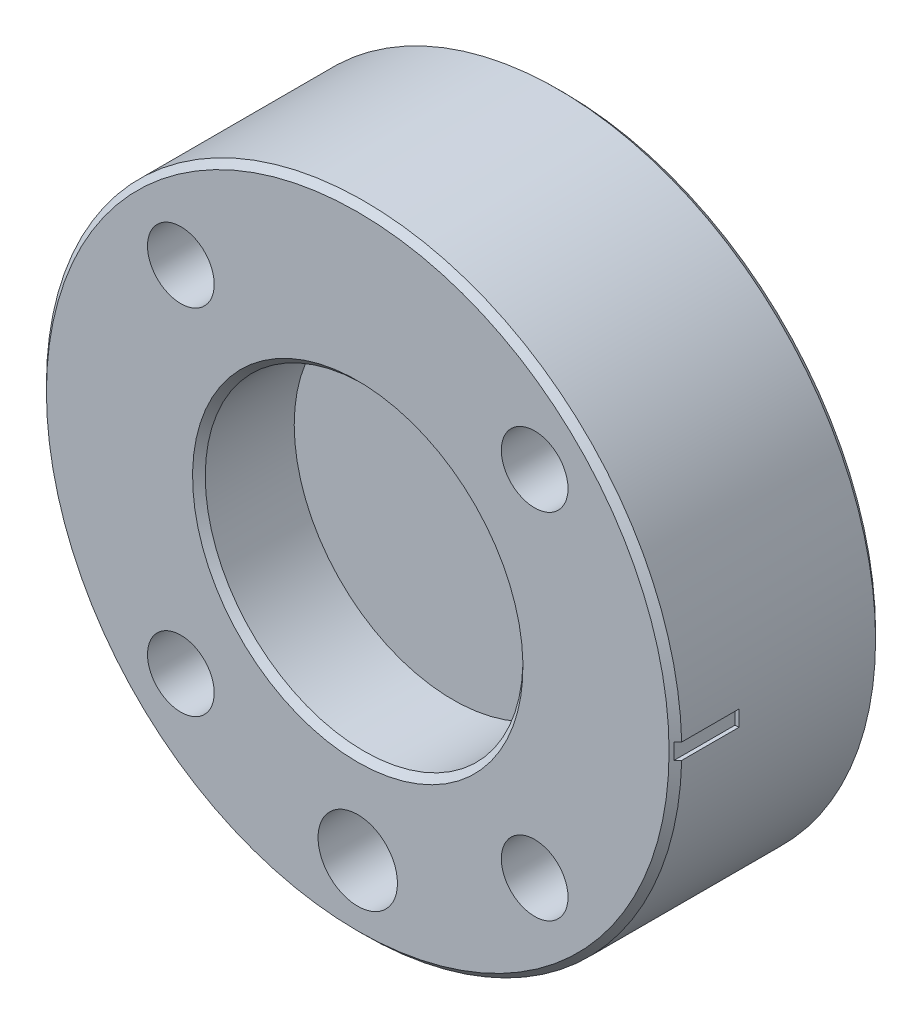
ISO-10303-21;
HEADER;
FILE_DESCRIPTION(('STEP AP214'),'2;1');
FILE_NAME('part.step','',(''),(''),'','','');
FILE_SCHEMA(('AUTOMOTIVE_DESIGN { 1 0 10303 214 1 1 1 1 }'));
ENDSEC;
DATA;
#1=APPLICATION_CONTEXT('core data for automotive mechanical design processes');
#2=APPLICATION_PROTOCOL_DEFINITION('international standard','automotive_design',2000,#1);
#3=PRODUCT_CONTEXT('',#1,'mechanical');
#4=PRODUCT('Part','Part','',(#3));
#5=PRODUCT_RELATED_PRODUCT_CATEGORY('part','',(#4));
#6=PRODUCT_DEFINITION_FORMATION('','',#4);
#7=PRODUCT_DEFINITION_CONTEXT('part definition',#1,'design');
#8=PRODUCT_DEFINITION('design','',#6,#7);
#9=PRODUCT_DEFINITION_SHAPE('','',#8);
#10=(LENGTH_UNIT() NAMED_UNIT(*) SI_UNIT(.MILLI.,.METRE.));
#11=(NAMED_UNIT(*) PLANE_ANGLE_UNIT() SI_UNIT($,.RADIAN.));
#12=(NAMED_UNIT(*) SI_UNIT($,.STERADIAN.) SOLID_ANGLE_UNIT());
#13=UNCERTAINTY_MEASURE_WITH_UNIT(LENGTH_MEASURE(1.E-05),#10,'distance_accuracy_value','');
#14=(GEOMETRIC_REPRESENTATION_CONTEXT(3) GLOBAL_UNCERTAINTY_ASSIGNED_CONTEXT((#13)) GLOBAL_UNIT_ASSIGNED_CONTEXT((#10,
#11,#12)) REPRESENTATION_CONTEXT('',''));
#15=CARTESIAN_POINT('',(0.,0.,0.));
#16=DIRECTION('',(0.,0.,1.));
#17=DIRECTION('',(1.,0.,0.));
#18=AXIS2_PLACEMENT_3D('',#15,#16,#17);
#19=CARTESIAN_POINT('',(0.,0.,7.));
#20=DIRECTION('',(0.,0.,-1.));
#21=DIRECTION('',(-1.,0.,0.));
#22=AXIS2_PLACEMENT_3D('',#19,#20,#21);
#23=PLANE('',#22);
#24=CARTESIAN_POINT('',(0.,0.,7.));
#25=DIRECTION('',(0.,0.,-1.));
#26=DIRECTION('',(-1.,0.,0.));
#27=AXIS2_PLACEMENT_3D('',#24,#25,#26);
#28=CIRCLE('',#27,10.);
#29=CARTESIAN_POINT('',(-10.,0.,7.));
#30=VERTEX_POINT('',#29);
#31=EDGE_CURVE('E89',#30,#30,#28,.F.);
#32=ORIENTED_EDGE('',*,*,#31,.T.);
#33=EDGE_LOOP('',(#32));
#34=FACE_BOUND('',#33,.T.);
#35=ADVANCED_FACE('F16',(#34),#23,.F.);
#36=CARTESIAN_POINT('',(11.1369318036882,11.136931803688,2.59999999991578));
#37=DIRECTION('',(0.,0.,1.));
#38=DIRECTION('',(1.,0.,0.));
#39=AXIS2_PLACEMENT_3D('',#36,#37,#38);
#40=CONICAL_SURFACE('',#39,2.09999999990165,1.02974425856416);
#41=CARTESIAN_POINT('',(11.1369318038328,11.136931803688,1.33819269993296));
#42=VERTEX_POINT('',#41);
#43=VERTEX_LOOP('',#42);
#44=FACE_BOUND('',#43,.T.);
#45=CARTESIAN_POINT('',(11.1369318036882,11.136931803688,2.6));
#46=DIRECTION('',(0.,0.,1.));
#47=DIRECTION('',(1.,0.,0.));
#48=AXIS2_PLACEMENT_3D('',#45,#46,#47);
#49=CIRCLE('',#48,2.09999999999999);
#50=CARTESIAN_POINT('',(13.2369318036882,11.136931803688,2.6));
#51=VERTEX_POINT('',#50);
#52=EDGE_CURVE('E86',#51,#51,#49,.T.);
#53=ORIENTED_EDGE('',*,*,#52,.T.);
#54=EDGE_LOOP('',(#53));
#55=FACE_BOUND('',#54,.T.);
#56=ADVANCED_FACE('F80',(#44,#55),#40,.F.);
#57=CARTESIAN_POINT('',(-11.1369318036881,11.1369318036882,2.59999999991578));
#58=DIRECTION('',(0.,0.,1.));
#59=DIRECTION('',(1.,0.,0.));
#60=AXIS2_PLACEMENT_3D('',#57,#58,#59);
#61=CONICAL_SURFACE('',#60,2.09999999978287,1.02974425851824);
#62=CARTESIAN_POINT('',(-11.1369318037449,11.1369318036882,1.33819269981927));
#63=VERTEX_POINT('',#62);
#64=VERTEX_LOOP('',#63);
#65=FACE_BOUND('',#64,.T.);
#66=CARTESIAN_POINT('',(-11.1369318036881,11.1369318036882,2.6));
#67=DIRECTION('',(0.,0.,1.));
#68=DIRECTION('',(1.,0.,0.));
#69=AXIS2_PLACEMENT_3D('',#66,#67,#68);
#70=CIRCLE('',#69,2.09999999999999);
#71=CARTESIAN_POINT('',(-9.03693180368807,11.1369318036882,2.6));
#72=VERTEX_POINT('',#71);
#73=EDGE_CURVE('E88',#72,#72,#70,.T.);
#74=ORIENTED_EDGE('',*,*,#73,.T.);
#75=EDGE_LOOP('',(#74));
#76=FACE_BOUND('',#75,.T.);
#77=ADVANCED_FACE('F83',(#65,#76),#61,.F.);
#78=CARTESIAN_POINT('',(-11.1369318036881,-11.1369318036881,2.60000000002947));
#79=DIRECTION('',(0.,0.,1.));
#80=DIRECTION('',(1.,0.,0.));
#81=AXIS2_PLACEMENT_3D('',#78,#79,#80);
#82=CONICAL_SURFACE('',#81,2.10000000006716,1.0297442586457);
#83=CARTESIAN_POINT('',(-11.1369318038328,-11.1369318036881,1.3381926999898));
#84=VERTEX_POINT('',#83);
#85=VERTEX_LOOP('',#84);
#86=FACE_BOUND('',#85,.T.);
#87=CARTESIAN_POINT('',(-11.1369318036881,-11.1369318036881,2.6));
#88=DIRECTION('',(0.,0.,1.));
#89=DIRECTION('',(1.,0.,0.));
#90=AXIS2_PLACEMENT_3D('',#87,#88,#89);
#91=CIRCLE('',#90,2.09999999999999);
#92=CARTESIAN_POINT('',(-9.03693180368814,-11.1369318036881,2.6));
#93=VERTEX_POINT('',#92);
#94=EDGE_CURVE('E92',#93,#93,#91,.T.);
#95=ORIENTED_EDGE('',*,*,#94,.T.);
#96=EDGE_LOOP('',(#95));
#97=FACE_BOUND('',#96,.T.);
#98=ADVANCED_FACE('F158',(#86,#97),#82,.F.);
#99=CARTESIAN_POINT('',(11.1369318036881,-11.1369318036881,2.59999999997262));
#100=DIRECTION('',(0.,0.,1.));
#101=DIRECTION('',(1.,0.,0.));
#102=AXIS2_PLACEMENT_3D('',#99,#100,#101);
#103=CONICAL_SURFACE('',#102,2.1000000001291,1.02974425864784);
#104=CARTESIAN_POINT('',(11.136931803776,-11.1369318036881,1.33819269996138));
#105=VERTEX_POINT('',#104);
#106=VERTEX_LOOP('',#105);
#107=FACE_BOUND('',#106,.T.);
#108=CARTESIAN_POINT('',(11.1369318036881,-11.1369318036881,2.6));
#109=DIRECTION('',(0.,0.,1.));
#110=DIRECTION('',(1.,0.,0.));
#111=AXIS2_PLACEMENT_3D('',#108,#109,#110);
#112=CIRCLE('',#111,2.09999999999999);
#113=CARTESIAN_POINT('',(13.2369318036881,-11.1369318036881,2.6));
#114=VERTEX_POINT('',#113);
#115=EDGE_CURVE('E153',#114,#114,#112,.T.);
#116=ORIENTED_EDGE('',*,*,#115,.T.);
#117=EDGE_LOOP('',(#116));
#118=FACE_BOUND('',#117,.T.);
#119=ADVANCED_FACE('F345',(#107,#118),#103,.F.);
#120=CARTESIAN_POINT('',(0.,-15.75,5.99999999991496));
#121=DIRECTION('',(0.,0.,1.));
#122=DIRECTION('',(0.,-1.,0.));
#123=AXIS2_PLACEMENT_3D('',#120,#121,#122);
#124=CONICAL_SURFACE('',#123,2.49999999988404,1.02974425862171);
#125=CARTESIAN_POINT('',(1.4210854715202E-10,-15.75,4.49784845235968));
#126=VERTEX_POINT('',#125);
#127=VERTEX_LOOP('',#126);
#128=FACE_BOUND('',#127,.T.);
#129=CARTESIAN_POINT('',(0.,-15.75,6.));
#130=DIRECTION('',(0.,0.,1.));
#131=DIRECTION('',(1.,0.,0.));
#132=AXIS2_PLACEMENT_3D('',#129,#130,#131);
#133=CIRCLE('',#132,2.49999999999999);
#134=CARTESIAN_POINT('',(2.49999999999999,-15.75,6.));
#135=VERTEX_POINT('',#134);
#136=EDGE_CURVE('E150',#135,#135,#133,.T.);
#137=ORIENTED_EDGE('',*,*,#136,.T.);
#138=EDGE_LOOP('',(#137));
#139=FACE_BOUND('',#138,.T.);
#140=ADVANCED_FACE('F243',(#128,#139),#124,.F.);
#141=CARTESIAN_POINT('',(0.,0.,13.));
#142=DIRECTION('',(0.,0.,-1.));
#143=DIRECTION('',(-1.,0.,0.));
#144=AXIS2_PLACEMENT_3D('',#141,#142,#143);
#145=CYLINDRICAL_SURFACE('',#144,10.);
#146=CARTESIAN_POINT('',(0.,0.,12.6));
#147=DIRECTION('',(0.,0.,1.));
#148=DIRECTION('',(0.,-1.,0.));
#149=AXIS2_PLACEMENT_3D('',#146,#147,#148);
#150=CIRCLE('',#149,10.);
#151=CARTESIAN_POINT('',(0.,-10.,12.6));
#152=VERTEX_POINT('',#151);
#153=EDGE_CURVE('E146',#152,#152,#150,.T.);
#154=ORIENTED_EDGE('',*,*,#153,.T.);
#155=EDGE_LOOP('',(#154));
#156=FACE_BOUND('',#155,.T.);
#157=ORIENTED_EDGE('',*,*,#31,.F.);
#158=EDGE_LOOP('',(#157));
#159=FACE_BOUND('',#158,.T.);
#160=ADVANCED_FACE('F234',(#156,#159),#145,.F.);
#161=CARTESIAN_POINT('',(11.1369318036882,11.136931803688,13.));
#162=DIRECTION('',(0.,0.,1.));
#163=DIRECTION('',(1.,0.,0.));
#164=AXIS2_PLACEMENT_3D('',#161,#162,#163);
#165=CYLINDRICAL_SURFACE('',#164,2.09999999999999);
#166=ORIENTED_EDGE('',*,*,#52,.F.);
#167=EDGE_LOOP('',(#166));
#168=FACE_BOUND('',#167,.T.);
#169=CARTESIAN_POINT('',(11.1369318036882,11.136931803688,13.));
#170=DIRECTION('',(0.,0.,1.));
#171=DIRECTION('',(1.,0.,0.));
#172=AXIS2_PLACEMENT_3D('',#169,#170,#171);
#173=CIRCLE('',#172,2.09999999999999);
#174=CARTESIAN_POINT('',(13.2369318036882,11.136931803688,13.));
#175=VERTEX_POINT('',#174);
#176=EDGE_CURVE('E149',#175,#175,#173,.F.);
#177=ORIENTED_EDGE('',*,*,#176,.F.);
#178=EDGE_LOOP('',(#177));
#179=FACE_BOUND('',#178,.T.);
#180=ADVANCED_FACE('F232',(#168,#179),#165,.F.);
#181=CARTESIAN_POINT('',(-11.1369318036881,11.1369318036882,13.));
#182=DIRECTION('',(0.,0.,1.));
#183=DIRECTION('',(1.,0.,0.));
#184=AXIS2_PLACEMENT_3D('',#181,#182,#183);
#185=CYLINDRICAL_SURFACE('',#184,2.09999999999999);
#186=ORIENTED_EDGE('',*,*,#73,.F.);
#187=EDGE_LOOP('',(#186));
#188=FACE_BOUND('',#187,.T.);
#189=CARTESIAN_POINT('',(-11.1369318036881,11.1369318036882,13.));
#190=DIRECTION('',(0.,0.,1.));
#191=DIRECTION('',(1.,0.,0.));
#192=AXIS2_PLACEMENT_3D('',#189,#190,#191);
#193=CIRCLE('',#192,2.09999999999999);
#194=CARTESIAN_POINT('',(-9.03693180368807,11.1369318036882,13.));
#195=VERTEX_POINT('',#194);
#196=EDGE_CURVE('E171',#195,#195,#193,.F.);
#197=ORIENTED_EDGE('',*,*,#196,.F.);
#198=EDGE_LOOP('',(#197));
#199=FACE_BOUND('',#198,.T.);
#200=ADVANCED_FACE('F164',(#188,#199),#185,.F.);
#201=CARTESIAN_POINT('',(-11.1369318036881,-11.1369318036881,13.));
#202=DIRECTION('',(0.,0.,1.));
#203=DIRECTION('',(1.,0.,0.));
#204=AXIS2_PLACEMENT_3D('',#201,#202,#203);
#205=CYLINDRICAL_SURFACE('',#204,2.09999999999999);
#206=ORIENTED_EDGE('',*,*,#94,.F.);
#207=EDGE_LOOP('',(#206));
#208=FACE_BOUND('',#207,.T.);
#209=CARTESIAN_POINT('',(-11.1369318036881,-11.1369318036881,13.));
#210=DIRECTION('',(0.,0.,1.));
#211=DIRECTION('',(1.,0.,0.));
#212=AXIS2_PLACEMENT_3D('',#209,#210,#211);
#213=CIRCLE('',#212,2.09999999999999);
#214=CARTESIAN_POINT('',(-9.03693180368814,-11.1369318036881,13.));
#215=VERTEX_POINT('',#214);
#216=EDGE_CURVE('E168',#215,#215,#213,.F.);
#217=ORIENTED_EDGE('',*,*,#216,.F.);
#218=EDGE_LOOP('',(#217));
#219=FACE_BOUND('',#218,.T.);
#220=ADVANCED_FACE('F160',(#208,#219),#205,.F.);
#221=CARTESIAN_POINT('',(11.1369318036881,-11.1369318036881,13.));
#222=DIRECTION('',(0.,0.,1.));
#223=DIRECTION('',(1.,0.,0.));
#224=AXIS2_PLACEMENT_3D('',#221,#222,#223);
#225=CYLINDRICAL_SURFACE('',#224,2.09999999999999);
#226=ORIENTED_EDGE('',*,*,#115,.F.);
#227=EDGE_LOOP('',(#226));
#228=FACE_BOUND('',#227,.T.);
#229=CARTESIAN_POINT('',(11.1369318036881,-11.1369318036881,13.));
#230=DIRECTION('',(0.,0.,1.));
#231=DIRECTION('',(1.,0.,0.));
#232=AXIS2_PLACEMENT_3D('',#229,#230,#231);
#233=CIRCLE('',#232,2.09999999999999);
#234=CARTESIAN_POINT('',(13.2369318036881,-11.1369318036881,13.));
#235=VERTEX_POINT('',#234);
#236=EDGE_CURVE('E170',#235,#235,#233,.F.);
#237=ORIENTED_EDGE('',*,*,#236,.F.);
#238=EDGE_LOOP('',(#237));
#239=FACE_BOUND('',#238,.T.);
#240=ADVANCED_FACE('F163',(#228,#239),#225,.F.);
#241=CARTESIAN_POINT('',(0.,-15.75,13.));
#242=DIRECTION('',(0.,0.,1.));
#243=DIRECTION('',(1.,0.,0.));
#244=AXIS2_PLACEMENT_3D('',#241,#242,#243);
#245=CYLINDRICAL_SURFACE('',#244,2.49999999999999);
#246=ORIENTED_EDGE('',*,*,#136,.F.);
#247=EDGE_LOOP('',(#246));
#248=FACE_BOUND('',#247,.T.);
#249=CARTESIAN_POINT('',(0.,-15.75,13.));
#250=DIRECTION('',(0.,0.,1.));
#251=DIRECTION('',(1.,0.,0.));
#252=AXIS2_PLACEMENT_3D('',#249,#250,#251);
#253=CIRCLE('',#252,2.49999999999999);
#254=CARTESIAN_POINT('',(2.49999999999999,-15.75,13.));
#255=VERTEX_POINT('',#254);
#256=EDGE_CURVE('E174',#255,#255,#253,.F.);
#257=ORIENTED_EDGE('',*,*,#256,.F.);
#258=EDGE_LOOP('',(#257));
#259=FACE_BOUND('',#258,.T.);
#260=ADVANCED_FACE('F299',(#248,#259),#245,.F.);
#261=CARTESIAN_POINT('',(0.,0.,13.));
#262=DIRECTION('',(0.,0.,1.));
#263=DIRECTION('',(0.,-1.,0.));
#264=AXIS2_PLACEMENT_3D('',#261,#262,#263);
#265=CONICAL_SURFACE('',#264,10.4,0.785398163397453);
#266=ORIENTED_EDGE('',*,*,#153,.F.);
#267=EDGE_LOOP('',(#266));
#268=FACE_BOUND('',#267,.T.);
#269=CARTESIAN_POINT('',(0.,0.,13.));
#270=DIRECTION('',(0.,0.,1.));
#271=DIRECTION('',(0.,-1.,0.));
#272=AXIS2_PLACEMENT_3D('',#269,#270,#271);
#273=CIRCLE('',#272,10.4);
#274=CARTESIAN_POINT('',(0.,-10.4,13.));
#275=VERTEX_POINT('',#274);
#276=EDGE_CURVE('E143',#275,#275,#273,.F.);
#277=ORIENTED_EDGE('',*,*,#276,.F.);
#278=EDGE_LOOP('',(#277));
#279=FACE_BOUND('',#278,.T.);
#280=ADVANCED_FACE('F220',(#268,#279),#265,.F.);
#281=CARTESIAN_POINT('',(0.,0.,13.));
#282=DIRECTION('',(0.,0.,1.));
#283=DIRECTION('',(1.,0.,0.));
#284=AXIS2_PLACEMENT_3D('',#281,#282,#283);
#285=PLANE('',#284);
#286=ORIENTED_EDGE('',*,*,#276,.T.);
#287=EDGE_LOOP('',(#286));
#288=FACE_BOUND('',#287,.T.);
#289=CARTESIAN_POINT('',(0.,0.,13.));
#290=DIRECTION('',(0.,0.,-1.));
#291=DIRECTION('',(-1.,0.,0.));
#292=AXIS2_PLACEMENT_3D('',#289,#290,#291);
#293=CIRCLE('',#292,19.6);
#294=CARTESIAN_POINT('',(-19.6,0.,13.));
#295=VERTEX_POINT('',#294);
#296=EDGE_CURVE('E199',#295,#295,#293,.T.);
#297=ORIENTED_EDGE('',*,*,#296,.F.);
#298=EDGE_LOOP('',(#297));
#299=FACE_BOUND('',#298,.T.);
#300=ORIENTED_EDGE('',*,*,#256,.T.);
#301=EDGE_LOOP('',(#300));
#302=FACE_BOUND('',#301,.T.);
#303=ORIENTED_EDGE('',*,*,#236,.T.);
#304=EDGE_LOOP('',(#303));
#305=FACE_BOUND('',#304,.T.);
#306=ORIENTED_EDGE('',*,*,#216,.T.);
#307=EDGE_LOOP('',(#306));
#308=FACE_BOUND('',#307,.T.);
#309=ORIENTED_EDGE('',*,*,#196,.T.);
#310=EDGE_LOOP('',(#309));
#311=FACE_BOUND('',#310,.T.);
#312=ORIENTED_EDGE('',*,*,#176,.T.);
#313=EDGE_LOOP('',(#312));
#314=FACE_BOUND('',#313,.T.);
#315=ADVANCED_FACE('F217',(#288,#299,#302,#305,#308,#311,#314),#285,.T.);
#316=CARTESIAN_POINT('',(19.753,-0.499251223833896,9.));
#317=DIRECTION('',(-1.,0.,0.));
#318=DIRECTION('',(0.,0.,1.));
#319=AXIS2_PLACEMENT_3D('',#316,#317,#318);
#320=PLANE('',#319);
#321=DIRECTION('',(0.,0.,-1.));
#322=VECTOR('',#321,1.);
#323=CARTESIAN_POINT('',(19.753,-0.499251223833896,9.));
#324=LINE('',#323,#322);
#325=CARTESIAN_POINT('',(19.753000070714,-0.499251223833896,12.8406917231872));
#326=VERTEX_POINT('',#325);
#327=CARTESIAN_POINT('',(19.753,-0.499251223833893,9.));
#328=VERTEX_POINT('',#327);
#329=EDGE_CURVE('E135',#326,#328,#324,.T.);
#330=ORIENTED_EDGE('',*,*,#329,.T.);
#331=DIRECTION('',(0.,1.,0.));
#332=VECTOR('',#331,1.);
#333=CARTESIAN_POINT('',(19.753,0.5,9.));
#334=LINE('',#333,#332);
#335=CARTESIAN_POINT('',(19.753,0.5,9.));
#336=VERTEX_POINT('',#335);
#337=EDGE_CURVE('E60',#328,#336,#334,.T.);
#338=ORIENTED_EDGE('',*,*,#337,.T.);
#339=DIRECTION('',(0.,0.,1.));
#340=VECTOR('',#339,1.);
#341=CARTESIAN_POINT('',(19.753,0.5,9.));
#342=LINE('',#341,#340);
#343=CARTESIAN_POINT('',(19.753,0.500000000000001,12.8406728606463));
#344=VERTEX_POINT('',#343);
#345=EDGE_CURVE('E192',#336,#344,#342,.T.);
#346=ORIENTED_EDGE('',*,*,#345,.T.);
#347=CARTESIAN_POINT('',(19.753,0.500000000000001,12.8406728606463));
#348=CARTESIAN_POINT('',(19.7530001048532,0.479165033461338,12.8411999751722));
#349=CARTESIAN_POINT('',(19.7530001889153,0.458329234637661,12.8416941972791));
#350=CARTESIAN_POINT('',(19.7530003243637,0.416659164379322,12.8426167507304));
#351=CARTESIAN_POINT('',(19.7530003757547,0.395824893153394,12.8430450915031));
#352=CARTESIAN_POINT('',(19.7530004547876,0.354157461666693,12.8438358825919));
#353=CARTESIAN_POINT('',(19.7530004824322,0.333324301547509,12.8441983403682));
#354=CARTESIAN_POINT('',(19.753000518724,0.291658675867342,12.8448573678865));
#355=CARTESIAN_POINT('',(19.7530005273728,0.270826210393175,12.8451539431171));
#356=CARTESIAN_POINT('',(19.753000527383,0.22916155745205,12.8456812073654));
#357=CARTESIAN_POINT('',(19.7530005187453,0.208329370029571,12.8459118998979));
#358=CARTESIAN_POINT('',(19.7530004824716,0.166664856562904,12.8463074008762));
#359=CARTESIAN_POINT('',(19.7530004548361,0.145832530533328,12.8464722108614));
#360=CARTESIAN_POINT('',(19.7530003758134,0.104167323154283,12.846735948265));
#361=CARTESIAN_POINT('',(19.753000324426,0.083334441802047,12.8468348752462));
#362=CARTESIAN_POINT('',(19.7530001889636,0.0416677070218295,12.8469668502914));
#363=CARTESIAN_POINT('',(19.7530001048873,0.0208338535862013,12.8469998959411));
#364=CARTESIAN_POINT('',(19.753,0.,12.847));
#365=B_SPLINE_CURVE_WITH_KNOTS('',3,(#347,#348,#349,#350,#351,#352,#353,#354,#355,#356,#357,
#358,#359,#360,#361,#362,#363,#364),.UNSPECIFIED.,.F.,.F.,(4,2,2,2,2,2,2,2,4),(0.,
0.0625248742364128,0.125040792206513,0.187549626886467,0.250053252026786,0.31255354200291,
0.37505237166546,0.437551616190384,0.500053150928922),.UNSPECIFIED.);
#366=CARTESIAN_POINT('',(19.753,0.,12.847));
#367=VERTEX_POINT('',#366);
#368=EDGE_CURVE('E109',#367,#344,#365,.F.);
#369=ORIENTED_EDGE('',*,*,#368,.F.);
#370=CARTESIAN_POINT('',(19.753,0.,12.847));
#371=CARTESIAN_POINT('',(19.7529999994119,-0.0208025782375528,12.8470000014123));
#372=CARTESIAN_POINT('',(19.7529999915082,-0.0416051564904486,12.8469671466323));
#373=CARTESIAN_POINT('',(19.7529999697563,-0.0832093660066752,12.8468357242532));
#374=CARTESIAN_POINT('',(19.7529999559082,-0.104010997277384,12.8467371589898));
#375=CARTESIAN_POINT('',(19.7529999309526,-0.145613727974709,12.8464743159466));
#376=CARTESIAN_POINT('',(19.7529999198449,-0.166414827403653,12.8463100385354));
#377=CARTESIAN_POINT('',(19.752999904894,-0.208016909530942,12.8459157736178));
#378=CARTESIAN_POINT('',(19.7529999010509,-0.22881789221414,12.8456857845132));
#379=CARTESIAN_POINT('',(19.752999902127,-0.27042015591933,12.8451600980245));
#380=CARTESIAN_POINT('',(19.7529999070468,-0.291221436896285,12.8448643970763));
#381=CARTESIAN_POINT('',(19.7529999237448,-0.332824712205813,12.8442072890166));
#382=CARTESIAN_POINT('',(19.7529999355237,-0.353626706451069,12.8438458763767));
#383=CARTESIAN_POINT('',(19.7529999610124,-0.395231823195526,12.8430573464467));
#384=CARTESIAN_POINT('',(19.7529999747225,-0.416034945552768,12.8426302216666));
#385=CARTESIAN_POINT('',(19.7529999949949,-0.457642733461506,12.8417102710684));
#386=CARTESIAN_POINT('',(19.7530000015561,-0.478447398804101,12.841217435802));
#387=CARTESIAN_POINT('',(19.753,-0.499251235104177,12.8406917935938));
#388=B_SPLINE_CURVE_WITH_KNOTS('',3,(#370,#371,#372,#373,#374,#375,#376,#377,#378,#379,#380,
#381,#382,#383,#384,#385,#386,#387),.UNSPECIFIED.,.F.,.F.,(4,2,2,2,2,2,2,2,4),(0.,
0.0624077087858564,0.124813199357457,0.187218339900463,0.24962499842462,0.312035042614689,
0.374450339681378,0.436872756212653,0.499304158025106),.UNSPECIFIED.);
#389=EDGE_CURVE('E132',#326,#367,#388,.F.);
#390=ORIENTED_EDGE('',*,*,#389,.F.);
#391=EDGE_LOOP('',(#330,#338,#346,#369,#390));
#392=FACE_BOUND('',#391,.T.);
#393=ADVANCED_FACE('F212',(#392),#320,.F.);
#394=CARTESIAN_POINT('',(19.753,-0.499251223833896,9.));
#395=DIRECTION('',(0.,-1.,0.));
#396=DIRECTION('',(0.,0.,-1.));
#397=AXIS2_PLACEMENT_3D('',#394,#395,#396);
#398=PLANE('',#397);
#399=DIRECTION('',(-1.,0.,0.));
#400=VECTOR('',#399,1.);
#401=CARTESIAN_POINT('',(19.753,-0.499251223833892,9.));
#402=LINE('',#401,#400);
#403=CARTESIAN_POINT('',(19.9937677343591,-0.49925122383389,9.));
#404=VERTEX_POINT('',#403);
#405=EDGE_CURVE('E142',#404,#328,#402,.T.);
#406=ORIENTED_EDGE('',*,*,#405,.T.);
#407=ORIENTED_EDGE('',*,*,#329,.F.);
#408=CARTESIAN_POINT('',(19.9937677343591,-0.499251223833896,12.6));
#409=CARTESIAN_POINT('',(19.9536398788364,-0.499251223833896,12.6401153520726));
#410=CARTESIAN_POINT('',(19.9135119849974,-0.499251223833896,12.6802306658168));
#411=CARTESIAN_POINT('',(19.8332561206869,-0.499251223833896,12.7604612166488));
#412=CARTESIAN_POINT('',(19.7931281502155,-0.499251223833896,12.8005764537364));
#413=CARTESIAN_POINT('',(19.7530001414279,-0.499251223833896,12.8406916524958));
#414=B_SPLINE_CURVE_WITH_KNOTS('',3,(#408,#409,#410,#411,#412,#413),.UNSPECIFIED.,.F.,.F.,(4,2,
4),(0.,0.170221550770713,0.340443101541427),.UNSPECIFIED.);
#415=CARTESIAN_POINT('',(19.9937677343591,-0.499251223833892,12.6));
#416=VERTEX_POINT('',#415);
#417=EDGE_CURVE('E110',#416,#326,#414,.T.);
#418=ORIENTED_EDGE('',*,*,#417,.F.);
#419=DIRECTION('',(0.,0.,-1.));
#420=VECTOR('',#419,1.);
#421=CARTESIAN_POINT('',(19.9937677343591,-0.499251223833888,13.));
#422=LINE('',#421,#420);
#423=EDGE_CURVE('E99',#404,#416,#422,.F.);
#424=ORIENTED_EDGE('',*,*,#423,.F.);
#425=EDGE_LOOP('',(#406,#407,#418,#424));
#426=FACE_BOUND('',#425,.T.);
#427=ADVANCED_FACE('F206',(#426),#398,.F.);
#428=CARTESIAN_POINT('',(19.753,0.5,9.));
#429=DIRECTION('',(0.,0.,-1.));
#430=DIRECTION('',(-1.,0.,0.));
#431=AXIS2_PLACEMENT_3D('',#428,#429,#430);
#432=PLANE('',#431);
#433=ORIENTED_EDGE('',*,*,#405,.F.);
#434=CARTESIAN_POINT('',(0.,0.,9.));
#435=DIRECTION('',(0.,0.,-1.));
#436=DIRECTION('',(-1.,0.,0.));
#437=AXIS2_PLACEMENT_3D('',#434,#435,#436);
#438=CIRCLE('',#437,20.);
#439=CARTESIAN_POINT('',(19.9937490231322,0.5,9.));
#440=VERTEX_POINT('',#439);
#441=EDGE_CURVE('E52',#440,#404,#438,.T.);
#442=ORIENTED_EDGE('',*,*,#441,.F.);
#443=DIRECTION('',(1.,0.,0.));
#444=VECTOR('',#443,1.);
#445=CARTESIAN_POINT('',(19.9937490231322,0.5,9.));
#446=LINE('',#445,#444);
#447=EDGE_CURVE('E108',#440,#336,#446,.F.);
#448=ORIENTED_EDGE('',*,*,#447,.T.);
#449=ORIENTED_EDGE('',*,*,#337,.F.);
#450=EDGE_LOOP('',(#433,#442,#448,#449));
#451=FACE_BOUND('',#450,.T.);
#452=ADVANCED_FACE('F124',(#451),#432,.F.);
#453=CARTESIAN_POINT('',(0.,0.,12.6));
#454=DIRECTION('',(0.,0.,-1.));
#455=DIRECTION('',(-1.,0.,0.));
#456=AXIS2_PLACEMENT_3D('',#453,#454,#455);
#457=CONICAL_SURFACE('',#456,20.,0.785398163397444);
#458=CARTESIAN_POINT('',(0.,0.,12.6));
#459=DIRECTION('',(0.,0.,-1.));
#460=DIRECTION('',(-1.,0.,0.));
#461=AXIS2_PLACEMENT_3D('',#458,#459,#460);
#462=CIRCLE('',#461,20.);
#463=CARTESIAN_POINT('',(19.9937490231322,0.5,12.6));
#464=VERTEX_POINT('',#463);
#465=EDGE_CURVE('E34',#416,#464,#462,.T.);
#466=ORIENTED_EDGE('',*,*,#465,.F.);
#467=ORIENTED_EDGE('',*,*,#417,.T.);
#468=ORIENTED_EDGE('',*,*,#389,.T.);
#469=ORIENTED_EDGE('',*,*,#368,.T.);
#470=CARTESIAN_POINT('',(19.753,0.5,12.8406728606463));
#471=CARTESIAN_POINT('',(19.7931249140392,0.5,12.8005607940801));
#472=CARTESIAN_POINT('',(19.8332497896531,0.5,12.7604486890764));
#473=CARTESIAN_POINT('',(19.9134994640305,0.5,12.6802244021943));
#474=CARTESIAN_POINT('',(19.953624262794,0.5,12.6401122203159));
#475=CARTESIAN_POINT('',(19.9937490231322,0.5,12.6));
#476=B_SPLINE_CURVE_WITH_KNOTS('',3,(#470,#471,#472,#473,#474,#475),.UNSPECIFIED.,.F.,.F.,(4,2,
4),(0.,0.17020834144578,0.340416682891554),.UNSPECIFIED.);
#477=EDGE_CURVE('E100',#344,#464,#476,.T.);
#478=ORIENTED_EDGE('',*,*,#477,.T.);
#479=EDGE_LOOP('',(#466,#467,#468,#469,#478));
#480=FACE_BOUND('',#479,.T.);
#481=ORIENTED_EDGE('',*,*,#296,.T.);
#482=EDGE_LOOP('',(#481));
#483=FACE_BOUND('',#482,.T.);
#484=ADVANCED_FACE('F120',(#480,#483),#457,.T.);
#485=CARTESIAN_POINT('',(19.9937490231322,0.5,9.));
#486=DIRECTION('',(0.,1.,0.));
#487=DIRECTION('',(0.,0.,1.));
#488=AXIS2_PLACEMENT_3D('',#485,#486,#487);
#489=PLANE('',#488);
#490=ORIENTED_EDGE('',*,*,#447,.F.);
#491=DIRECTION('',(0.,0.,-1.));
#492=VECTOR('',#491,1.);
#493=CARTESIAN_POINT('',(19.9937490231322,0.5,13.));
#494=LINE('',#493,#492);
#495=EDGE_CURVE('E181',#464,#440,#494,.T.);
#496=ORIENTED_EDGE('',*,*,#495,.F.);
#497=ORIENTED_EDGE('',*,*,#477,.F.);
#498=ORIENTED_EDGE('',*,*,#345,.F.);
#499=EDGE_LOOP('',(#490,#496,#497,#498));
#500=FACE_BOUND('',#499,.T.);
#501=ADVANCED_FACE('F117',(#500),#489,.F.);
#502=CARTESIAN_POINT('',(0.,0.,13.));
#503=DIRECTION('',(0.,0.,-1.));
#504=DIRECTION('',(-1.,0.,0.));
#505=AXIS2_PLACEMENT_3D('',#502,#503,#504);
#506=CYLINDRICAL_SURFACE('',#505,20.);
#507=CARTESIAN_POINT('',(0.,0.,0.400000000000025));
#508=DIRECTION('',(0.,0.,1.));
#509=DIRECTION('',(1.,0.,0.));
#510=AXIS2_PLACEMENT_3D('',#507,#508,#509);
#511=CIRCLE('',#510,20.);
#512=CARTESIAN_POINT('',(20.,0.,0.400000000000024));
#513=VERTEX_POINT('',#512);
#514=EDGE_CURVE('E25',#513,#513,#511,.F.);
#515=ORIENTED_EDGE('',*,*,#514,.F.);
#516=EDGE_LOOP('',(#515));
#517=FACE_BOUND('',#516,.T.);
#518=ORIENTED_EDGE('',*,*,#465,.T.);
#519=ORIENTED_EDGE('',*,*,#495,.T.);
#520=ORIENTED_EDGE('',*,*,#441,.T.);
#521=ORIENTED_EDGE('',*,*,#423,.T.);
#522=EDGE_LOOP('',(#518,#519,#520,#521));
#523=FACE_BOUND('',#522,.T.);
#524=ADVANCED_FACE('F254',(#517,#523),#506,.T.);
#525=CARTESIAN_POINT('',(0.,0.,0.400000000000025));
#526=DIRECTION('',(0.,0.,1.));
#527=DIRECTION('',(1.,0.,0.));
#528=AXIS2_PLACEMENT_3D('',#525,#526,#527);
#529=CONICAL_SURFACE('',#528,20.,0.785398163397444);
#530=ORIENTED_EDGE('',*,*,#514,.T.);
#531=EDGE_LOOP('',(#530));
#532=FACE_BOUND('',#531,.T.);
#533=CARTESIAN_POINT('',(0.,0.,0.));
#534=DIRECTION('',(0.,0.,1.));
#535=DIRECTION('',(1.,0.,0.));
#536=AXIS2_PLACEMENT_3D('',#533,#534,#535);
#537=CIRCLE('',#536,19.6);
#538=CARTESIAN_POINT('',(19.6,0.,0.));
#539=VERTEX_POINT('',#538);
#540=EDGE_CURVE('E11',#539,#539,#537,.T.);
#541=ORIENTED_EDGE('',*,*,#540,.T.);
#542=EDGE_LOOP('',(#541));
#543=FACE_BOUND('',#542,.T.);
#544=ADVANCED_FACE('F248',(#532,#543),#529,.T.);
#545=CARTESIAN_POINT('',(0.,0.,0.));
#546=DIRECTION('',(0.,0.,1.));
#547=DIRECTION('',(1.,0.,0.));
#548=AXIS2_PLACEMENT_3D('',#545,#546,#547);
#549=PLANE('',#548);
#550=ORIENTED_EDGE('',*,*,#540,.F.);
#551=EDGE_LOOP('',(#550));
#552=FACE_BOUND('',#551,.T.);
#553=ADVANCED_FACE('F246',(#552),#549,.F.);
#554=CLOSED_SHELL('',(#35,#56,#77,#98,#119,#140,#160,#180,#200,#220,#240,#260,#280,#315,#393,
#427,#452,#484,#501,#524,#544,#553));
#555=MANIFOLD_SOLID_BREP('B1',#554);
#556=ADVANCED_BREP_SHAPE_REPRESENTATION('',(#18,#555),#14);
#557=SHAPE_DEFINITION_REPRESENTATION(#9,#556);
ENDSEC;
END-ISO-10303-21;
